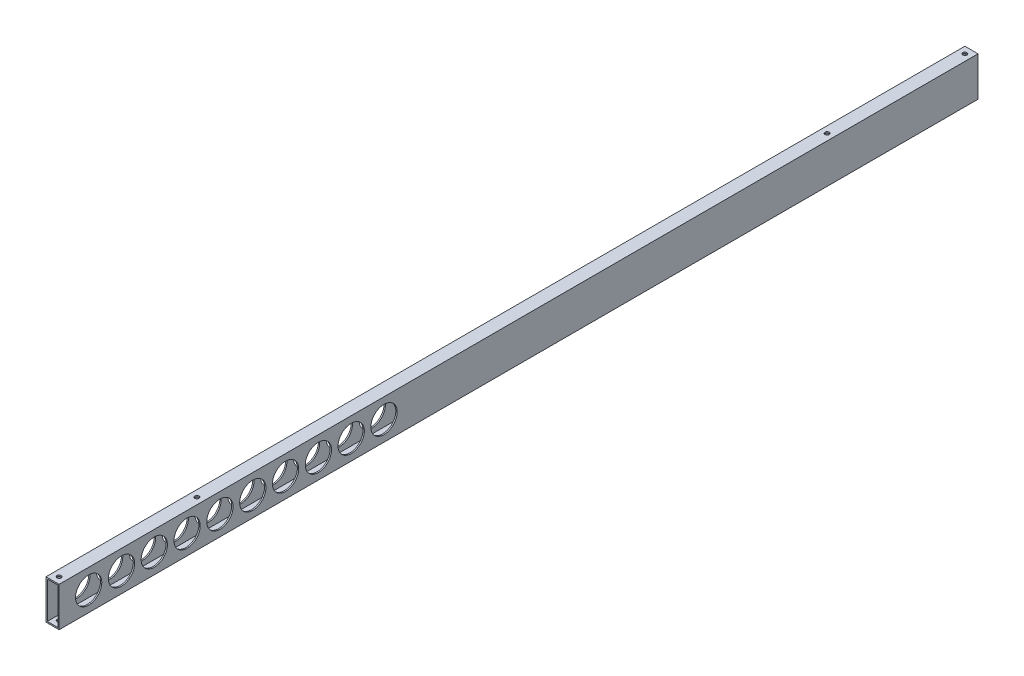
ISO-10303-21;
HEADER;
FILE_DESCRIPTION(('STEP AP214'),'2;1');
FILE_NAME('part.step','',(''),(''),'','','');
FILE_SCHEMA(('AUTOMOTIVE_DESIGN { 1 0 10303 214 1 1 1 1 }'));
ENDSEC;
DATA;
#1=APPLICATION_CONTEXT('core data for automotive mechanical design processes');
#2=APPLICATION_PROTOCOL_DEFINITION('international standard','automotive_design',2000,#1);
#3=PRODUCT_CONTEXT('',#1,'mechanical');
#4=PRODUCT('Part','Part','',(#3));
#5=PRODUCT_RELATED_PRODUCT_CATEGORY('part','',(#4));
#6=PRODUCT_DEFINITION_FORMATION('','',#4);
#7=PRODUCT_DEFINITION_CONTEXT('part definition',#1,'design');
#8=PRODUCT_DEFINITION('design','',#6,#7);
#9=PRODUCT_DEFINITION_SHAPE('','',#8);
#10=(LENGTH_UNIT() NAMED_UNIT(*) SI_UNIT(.MILLI.,.METRE.));
#11=(NAMED_UNIT(*) PLANE_ANGLE_UNIT() SI_UNIT($,.RADIAN.));
#12=(NAMED_UNIT(*) SI_UNIT($,.STERADIAN.) SOLID_ANGLE_UNIT());
#13=UNCERTAINTY_MEASURE_WITH_UNIT(LENGTH_MEASURE(1.E-05),#10,'distance_accuracy_value','');
#14=(GEOMETRIC_REPRESENTATION_CONTEXT(3) GLOBAL_UNCERTAINTY_ASSIGNED_CONTEXT((#13)) GLOBAL_UNIT_ASSIGNED_CONTEXT((#10,
#11,#12)) REPRESENTATION_CONTEXT('',''));
#15=CARTESIAN_POINT('',(0.,0.,0.));
#16=DIRECTION('',(0.,0.,1.));
#17=DIRECTION('',(1.,0.,0.));
#18=AXIS2_PLACEMENT_3D('',#15,#16,#17);
#19=CARTESIAN_POINT('',(0.,0.,700.));
#20=DIRECTION('',(0.,0.,1.));
#21=DIRECTION('',(1.,0.,0.));
#22=AXIS2_PLACEMENT_3D('',#19,#20,#21);
#23=PLANE('',#22);
#24=DIRECTION('',(0.,-1.,0.));
#25=VECTOR('',#24,1.);
#26=CARTESIAN_POINT('',(-5.,-15.,700.));
#27=LINE('',#26,#25);
#28=CARTESIAN_POINT('',(-5.,15.,700.));
#29=VERTEX_POINT('',#28);
#30=CARTESIAN_POINT('',(-5.,-15.,700.));
#31=VERTEX_POINT('',#30);
#32=EDGE_CURVE('E162',#29,#31,#27,.T.);
#33=ORIENTED_EDGE('',*,*,#32,.T.);
#34=DIRECTION('',(1.,0.,0.));
#35=VECTOR('',#34,1.);
#36=CARTESIAN_POINT('',(5.,-15.,700.));
#37=LINE('',#36,#35);
#38=CARTESIAN_POINT('',(5.,-15.,700.));
#39=VERTEX_POINT('',#38);
#40=EDGE_CURVE('E165',#31,#39,#37,.T.);
#41=ORIENTED_EDGE('',*,*,#40,.T.);
#42=DIRECTION('',(0.,1.,0.));
#43=VECTOR('',#42,1.);
#44=CARTESIAN_POINT('',(5.,-15.,700.));
#45=LINE('',#44,#43);
#46=CARTESIAN_POINT('',(5.,15.,700.));
#47=VERTEX_POINT('',#46);
#48=EDGE_CURVE('E168',#39,#47,#45,.T.);
#49=ORIENTED_EDGE('',*,*,#48,.T.);
#50=DIRECTION('',(-1.,0.,0.));
#51=VECTOR('',#50,1.);
#52=CARTESIAN_POINT('',(5.,15.,700.));
#53=LINE('',#52,#51);
#54=EDGE_CURVE('E170',#47,#29,#53,.T.);
#55=ORIENTED_EDGE('',*,*,#54,.T.);
#56=EDGE_LOOP('',(#33,#41,#49,#55));
#57=FACE_BOUND('',#56,.T.);
#58=DIRECTION('',(1.,0.,0.));
#59=VECTOR('',#58,1.);
#60=CARTESIAN_POINT('',(5.,-14.,700.));
#61=LINE('',#60,#59);
#62=CARTESIAN_POINT('',(-4.,-14.,700.));
#63=VERTEX_POINT('',#62);
#64=CARTESIAN_POINT('',(4.,-14.,700.));
#65=VERTEX_POINT('',#64);
#66=EDGE_CURVE('E132',#63,#65,#61,.T.);
#67=ORIENTED_EDGE('',*,*,#66,.F.);
#68=DIRECTION('',(0.,-1.,0.));
#69=VECTOR('',#68,1.);
#70=CARTESIAN_POINT('',(-4.,-15.,700.));
#71=LINE('',#70,#69);
#72=CARTESIAN_POINT('',(-4.,14.,700.));
#73=VERTEX_POINT('',#72);
#74=EDGE_CURVE('E124',#73,#63,#71,.T.);
#75=ORIENTED_EDGE('',*,*,#74,.F.);
#76=DIRECTION('',(-1.,0.,0.));
#77=VECTOR('',#76,1.);
#78=CARTESIAN_POINT('',(5.,14.,700.));
#79=LINE('',#78,#77);
#80=CARTESIAN_POINT('',(4.,14.,700.));
#81=VERTEX_POINT('',#80);
#82=EDGE_CURVE('E146',#81,#73,#79,.T.);
#83=ORIENTED_EDGE('',*,*,#82,.F.);
#84=DIRECTION('',(0.,1.,0.));
#85=VECTOR('',#84,1.);
#86=CARTESIAN_POINT('',(4.,-15.,700.));
#87=LINE('',#86,#85);
#88=EDGE_CURVE('E144',#65,#81,#87,.T.);
#89=ORIENTED_EDGE('',*,*,#88,.F.);
#90=EDGE_LOOP('',(#67,#75,#83,#89));
#91=FACE_BOUND('',#90,.T.);
#92=ADVANCED_FACE('F57',(#57,#91),#23,.T.);
#93=CARTESIAN_POINT('',(0.,0.,0.));
#94=DIRECTION('',(0.,0.,1.));
#95=DIRECTION('',(1.,0.,0.));
#96=AXIS2_PLACEMENT_3D('',#93,#94,#95);
#97=PLANE('',#96);
#98=DIRECTION('',(0.,-1.,0.));
#99=VECTOR('',#98,1.);
#100=CARTESIAN_POINT('',(-5.,-15.,0.));
#101=LINE('',#100,#99);
#102=CARTESIAN_POINT('',(-5.,15.,0.));
#103=VERTEX_POINT('',#102);
#104=CARTESIAN_POINT('',(-5.,-15.,0.));
#105=VERTEX_POINT('',#104);
#106=EDGE_CURVE('E140',#103,#105,#101,.T.);
#107=ORIENTED_EDGE('',*,*,#106,.F.);
#108=DIRECTION('',(-1.,0.,0.));
#109=VECTOR('',#108,1.);
#110=CARTESIAN_POINT('',(5.,15.,0.));
#111=LINE('',#110,#109);
#112=CARTESIAN_POINT('',(5.,15.,0.));
#113=VERTEX_POINT('',#112);
#114=EDGE_CURVE('E166',#113,#103,#111,.T.);
#115=ORIENTED_EDGE('',*,*,#114,.F.);
#116=DIRECTION('',(0.,1.,0.));
#117=VECTOR('',#116,1.);
#118=CARTESIAN_POINT('',(5.,-15.,0.));
#119=LINE('',#118,#117);
#120=CARTESIAN_POINT('',(5.,-15.,0.));
#121=VERTEX_POINT('',#120);
#122=EDGE_CURVE('E177',#121,#113,#119,.T.);
#123=ORIENTED_EDGE('',*,*,#122,.F.);
#124=DIRECTION('',(1.,0.,0.));
#125=VECTOR('',#124,1.);
#126=CARTESIAN_POINT('',(5.,-15.,0.));
#127=LINE('',#126,#125);
#128=EDGE_CURVE('E175',#105,#121,#127,.T.);
#129=ORIENTED_EDGE('',*,*,#128,.F.);
#130=EDGE_LOOP('',(#107,#115,#123,#129));
#131=FACE_BOUND('',#130,.T.);
#132=DIRECTION('',(0.,-1.,0.));
#133=VECTOR('',#132,1.);
#134=CARTESIAN_POINT('',(-4.,-15.,0.));
#135=LINE('',#134,#133);
#136=CARTESIAN_POINT('',(-4.,14.,0.));
#137=VERTEX_POINT('',#136);
#138=CARTESIAN_POINT('',(-4.,-14.,0.));
#139=VERTEX_POINT('',#138);
#140=EDGE_CURVE('E82',#137,#139,#135,.T.);
#141=ORIENTED_EDGE('',*,*,#140,.T.);
#142=DIRECTION('',(1.,0.,0.));
#143=VECTOR('',#142,1.);
#144=CARTESIAN_POINT('',(5.,-14.,0.));
#145=LINE('',#144,#143);
#146=CARTESIAN_POINT('',(4.,-14.,0.));
#147=VERTEX_POINT('',#146);
#148=EDGE_CURVE('E139',#139,#147,#145,.T.);
#149=ORIENTED_EDGE('',*,*,#148,.T.);
#150=DIRECTION('',(0.,1.,0.));
#151=VECTOR('',#150,1.);
#152=CARTESIAN_POINT('',(4.,-15.,0.));
#153=LINE('',#152,#151);
#154=CARTESIAN_POINT('',(4.,14.,0.));
#155=VERTEX_POINT('',#154);
#156=EDGE_CURVE('E154',#147,#155,#153,.T.);
#157=ORIENTED_EDGE('',*,*,#156,.T.);
#158=DIRECTION('',(-1.,0.,0.));
#159=VECTOR('',#158,1.);
#160=CARTESIAN_POINT('',(5.,14.,0.));
#161=LINE('',#160,#159);
#162=EDGE_CURVE('E133',#155,#137,#161,.T.);
#163=ORIENTED_EDGE('',*,*,#162,.T.);
#164=EDGE_LOOP('',(#141,#149,#157,#163));
#165=FACE_BOUND('',#164,.T.);
#166=ADVANCED_FACE('F319',(#131,#165),#97,.F.);
#167=CARTESIAN_POINT('',(-5.,-15.,700.));
#168=DIRECTION('',(1.,0.,0.));
#169=DIRECTION('',(0.,0.,-1.));
#170=AXIS2_PLACEMENT_3D('',#167,#168,#169);
#171=PLANE('',#170);
#172=CARTESIAN_POINT('',(-5.,0.,677.5));
#173=DIRECTION('',(1.,0.,0.));
#174=DIRECTION('',(0.,0.,-1.));
#175=AXIS2_PLACEMENT_3D('',#172,#173,#174);
#176=CIRCLE('',#175,9.99999999999998);
#177=CARTESIAN_POINT('',(-5.,0.,667.5));
#178=VERTEX_POINT('',#177);
#179=EDGE_CURVE('E207',#178,#178,#176,.T.);
#180=ORIENTED_EDGE('',*,*,#179,.T.);
#181=EDGE_LOOP('',(#180));
#182=FACE_BOUND('',#181,.T.);
#183=CARTESIAN_POINT('',(-5.,0.,652.5));
#184=DIRECTION('',(1.,0.,0.));
#185=DIRECTION('',(0.,0.,-1.));
#186=AXIS2_PLACEMENT_3D('',#183,#184,#185);
#187=CIRCLE('',#186,9.99999999999998);
#188=CARTESIAN_POINT('',(-5.,0.,642.5));
#189=VERTEX_POINT('',#188);
#190=EDGE_CURVE('E436',#189,#189,#187,.T.);
#191=ORIENTED_EDGE('',*,*,#190,.T.);
#192=EDGE_LOOP('',(#191));
#193=FACE_BOUND('',#192,.T.);
#194=CARTESIAN_POINT('',(-5.,0.,627.5));
#195=DIRECTION('',(1.,0.,0.));
#196=DIRECTION('',(0.,0.,-1.));
#197=AXIS2_PLACEMENT_3D('',#194,#195,#196);
#198=CIRCLE('',#197,9.99999999999998);
#199=CARTESIAN_POINT('',(-5.,0.,617.5));
#200=VERTEX_POINT('',#199);
#201=EDGE_CURVE('E440',#200,#200,#198,.T.);
#202=ORIENTED_EDGE('',*,*,#201,.T.);
#203=EDGE_LOOP('',(#202));
#204=FACE_BOUND('',#203,.T.);
#205=CARTESIAN_POINT('',(-5.,0.,602.5));
#206=DIRECTION('',(1.,0.,0.));
#207=DIRECTION('',(0.,0.,-1.));
#208=AXIS2_PLACEMENT_3D('',#205,#206,#207);
#209=CIRCLE('',#208,10.0000000000001);
#210=CARTESIAN_POINT('',(-5.,0.,592.5));
#211=VERTEX_POINT('',#210);
#212=EDGE_CURVE('E444',#211,#211,#209,.T.);
#213=ORIENTED_EDGE('',*,*,#212,.T.);
#214=EDGE_LOOP('',(#213));
#215=FACE_BOUND('',#214,.T.);
#216=CARTESIAN_POINT('',(-5.,0.,577.5));
#217=DIRECTION('',(1.,0.,0.));
#218=DIRECTION('',(0.,0.,-1.));
#219=AXIS2_PLACEMENT_3D('',#216,#217,#218);
#220=CIRCLE('',#219,9.99999999999998);
#221=CARTESIAN_POINT('',(-5.,0.,567.5));
#222=VERTEX_POINT('',#221);
#223=EDGE_CURVE('E448',#222,#222,#220,.T.);
#224=ORIENTED_EDGE('',*,*,#223,.T.);
#225=EDGE_LOOP('',(#224));
#226=FACE_BOUND('',#225,.T.);
#227=CARTESIAN_POINT('',(-5.,0.,552.5));
#228=DIRECTION('',(1.,0.,0.));
#229=DIRECTION('',(0.,0.,-1.));
#230=AXIS2_PLACEMENT_3D('',#227,#228,#229);
#231=CIRCLE('',#230,9.99999999999998);
#232=CARTESIAN_POINT('',(-5.,0.,542.5));
#233=VERTEX_POINT('',#232);
#234=EDGE_CURVE('E452',#233,#233,#231,.T.);
#235=ORIENTED_EDGE('',*,*,#234,.T.);
#236=EDGE_LOOP('',(#235));
#237=FACE_BOUND('',#236,.T.);
#238=CARTESIAN_POINT('',(-5.,0.,527.5));
#239=DIRECTION('',(1.,0.,0.));
#240=DIRECTION('',(0.,0.,-1.));
#241=AXIS2_PLACEMENT_3D('',#238,#239,#240);
#242=CIRCLE('',#241,9.99999999999998);
#243=CARTESIAN_POINT('',(-5.,0.,517.5));
#244=VERTEX_POINT('',#243);
#245=EDGE_CURVE('E456',#244,#244,#242,.T.);
#246=ORIENTED_EDGE('',*,*,#245,.T.);
#247=EDGE_LOOP('',(#246));
#248=FACE_BOUND('',#247,.T.);
#249=CARTESIAN_POINT('',(-5.,0.,502.5));
#250=DIRECTION('',(1.,0.,0.));
#251=DIRECTION('',(0.,0.,-1.));
#252=AXIS2_PLACEMENT_3D('',#249,#250,#251);
#253=CIRCLE('',#252,9.99999999999998);
#254=CARTESIAN_POINT('',(-5.,0.,492.5));
#255=VERTEX_POINT('',#254);
#256=EDGE_CURVE('E460',#255,#255,#253,.T.);
#257=ORIENTED_EDGE('',*,*,#256,.T.);
#258=EDGE_LOOP('',(#257));
#259=FACE_BOUND('',#258,.T.);
#260=CARTESIAN_POINT('',(-5.,0.,477.5));
#261=DIRECTION('',(1.,0.,0.));
#262=DIRECTION('',(0.,0.,-1.));
#263=AXIS2_PLACEMENT_3D('',#260,#261,#262);
#264=CIRCLE('',#263,9.99999999999998);
#265=CARTESIAN_POINT('',(-5.,0.,467.5));
#266=VERTEX_POINT('',#265);
#267=EDGE_CURVE('E463',#266,#266,#264,.T.);
#268=ORIENTED_EDGE('',*,*,#267,.T.);
#269=EDGE_LOOP('',(#268));
#270=FACE_BOUND('',#269,.T.);
#271=CARTESIAN_POINT('',(-5.,0.,452.5));
#272=DIRECTION('',(1.,0.,0.));
#273=DIRECTION('',(0.,0.,-1.));
#274=AXIS2_PLACEMENT_3D('',#271,#272,#273);
#275=CIRCLE('',#274,9.99999999999998);
#276=CARTESIAN_POINT('',(-5.,0.,442.5));
#277=VERTEX_POINT('',#276);
#278=EDGE_CURVE('E383',#277,#277,#275,.T.);
#279=ORIENTED_EDGE('',*,*,#278,.T.);
#280=EDGE_LOOP('',(#279));
#281=FACE_BOUND('',#280,.T.);
#282=ORIENTED_EDGE('',*,*,#106,.T.);
#283=DIRECTION('',(0.,0.,-1.));
#284=VECTOR('',#283,1.);
#285=CARTESIAN_POINT('',(-5.,-15.,700.));
#286=LINE('',#285,#284);
#287=EDGE_CURVE('E12',#31,#105,#286,.T.);
#288=ORIENTED_EDGE('',*,*,#287,.F.);
#289=ORIENTED_EDGE('',*,*,#32,.F.);
#290=DIRECTION('',(0.,0.,-1.));
#291=VECTOR('',#290,1.);
#292=CARTESIAN_POINT('',(-5.,15.,700.));
#293=LINE('',#292,#291);
#294=EDGE_CURVE('E172',#29,#103,#293,.T.);
#295=ORIENTED_EDGE('',*,*,#294,.T.);
#296=EDGE_LOOP('',(#282,#288,#289,#295));
#297=FACE_BOUND('',#296,.T.);
#298=ADVANCED_FACE('F59',(#182,#193,#204,#215,#226,#237,#248,#259,#270,#281,#297),#171,.F.);
#299=CARTESIAN_POINT('',(5.,-15.,700.));
#300=DIRECTION('',(0.,1.,0.));
#301=DIRECTION('',(-1.,0.,0.));
#302=AXIS2_PLACEMENT_3D('',#299,#300,#301);
#303=PLANE('',#302);
#304=CARTESIAN_POINT('',(0.,-15.,5.));
#305=DIRECTION('',(0.,1.,0.));
#306=DIRECTION('',(0.,0.,1.));
#307=AXIS2_PLACEMENT_3D('',#304,#305,#306);
#308=CIRCLE('',#307,1.6);
#309=CARTESIAN_POINT('',(0.,-15.,6.6));
#310=VERTEX_POINT('',#309);
#311=EDGE_CURVE('E191',#310,#310,#308,.T.);
#312=ORIENTED_EDGE('',*,*,#311,.T.);
#313=EDGE_LOOP('',(#312));
#314=FACE_BOUND('',#313,.T.);
#315=CARTESIAN_POINT('',(0.,-15.,590.));
#316=DIRECTION('',(0.,1.,0.));
#317=DIRECTION('',(0.,0.,-1.));
#318=AXIS2_PLACEMENT_3D('',#315,#316,#317);
#319=CIRCLE('',#318,1.59999999999999);
#320=CARTESIAN_POINT('',(0.,-15.,588.4));
#321=VERTEX_POINT('',#320);
#322=EDGE_CURVE('E259',#321,#321,#319,.T.);
#323=ORIENTED_EDGE('',*,*,#322,.T.);
#324=EDGE_LOOP('',(#323));
#325=FACE_BOUND('',#324,.T.);
#326=CARTESIAN_POINT('',(0.,-15.,695.));
#327=DIRECTION('',(0.,1.,0.));
#328=DIRECTION('',(0.,0.,-1.));
#329=AXIS2_PLACEMENT_3D('',#326,#327,#328);
#330=CIRCLE('',#329,1.59999999999999);
#331=CARTESIAN_POINT('',(0.,-15.,693.4));
#332=VERTEX_POINT('',#331);
#333=EDGE_CURVE('E270',#332,#332,#330,.T.);
#334=ORIENTED_EDGE('',*,*,#333,.T.);
#335=EDGE_LOOP('',(#334));
#336=FACE_BOUND('',#335,.T.);
#337=CARTESIAN_POINT('',(0.,-15.,110.));
#338=DIRECTION('',(0.,1.,0.));
#339=DIRECTION('',(0.,0.,1.));
#340=AXIS2_PLACEMENT_3D('',#337,#338,#339);
#341=CIRCLE('',#340,1.6);
#342=CARTESIAN_POINT('',(0.,-15.,111.6));
#343=VERTEX_POINT('',#342);
#344=EDGE_CURVE('E258',#343,#343,#341,.T.);
#345=ORIENTED_EDGE('',*,*,#344,.T.);
#346=EDGE_LOOP('',(#345));
#347=FACE_BOUND('',#346,.T.);
#348=ORIENTED_EDGE('',*,*,#128,.T.);
#349=DIRECTION('',(0.,0.,-1.));
#350=VECTOR('',#349,1.);
#351=CARTESIAN_POINT('',(5.,-15.,700.));
#352=LINE('',#351,#350);
#353=EDGE_CURVE('E66',#39,#121,#352,.T.);
#354=ORIENTED_EDGE('',*,*,#353,.F.);
#355=ORIENTED_EDGE('',*,*,#40,.F.);
#356=ORIENTED_EDGE('',*,*,#287,.T.);
#357=EDGE_LOOP('',(#348,#354,#355,#356));
#358=FACE_BOUND('',#357,.T.);
#359=ADVANCED_FACE('F305',(#314,#325,#336,#347,#358),#303,.F.);
#360=CARTESIAN_POINT('',(5.,-15.,700.));
#361=DIRECTION('',(-1.,0.,0.));
#362=DIRECTION('',(0.,0.,1.));
#363=AXIS2_PLACEMENT_3D('',#360,#361,#362);
#364=PLANE('',#363);
#365=CARTESIAN_POINT('',(5.,0.,677.5));
#366=DIRECTION('',(1.,0.,0.));
#367=DIRECTION('',(0.,0.,-1.));
#368=AXIS2_PLACEMENT_3D('',#365,#366,#367);
#369=CIRCLE('',#368,9.99999999999998);
#370=CARTESIAN_POINT('',(5.,0.,667.5));
#371=VERTEX_POINT('',#370);
#372=EDGE_CURVE('E346',#371,#371,#369,.T.);
#373=ORIENTED_EDGE('',*,*,#372,.F.);
#374=EDGE_LOOP('',(#373));
#375=FACE_BOUND('',#374,.T.);
#376=CARTESIAN_POINT('',(5.,0.,652.5));
#377=DIRECTION('',(1.,0.,0.));
#378=DIRECTION('',(0.,0.,-1.));
#379=AXIS2_PLACEMENT_3D('',#376,#377,#378);
#380=CIRCLE('',#379,9.99999999999998);
#381=CARTESIAN_POINT('',(5.,0.,642.5));
#382=VERTEX_POINT('',#381);
#383=EDGE_CURVE('E350',#382,#382,#380,.T.);
#384=ORIENTED_EDGE('',*,*,#383,.F.);
#385=EDGE_LOOP('',(#384));
#386=FACE_BOUND('',#385,.T.);
#387=CARTESIAN_POINT('',(5.,0.,627.5));
#388=DIRECTION('',(1.,0.,0.));
#389=DIRECTION('',(0.,0.,-1.));
#390=AXIS2_PLACEMENT_3D('',#387,#388,#389);
#391=CIRCLE('',#390,9.99999999999998);
#392=CARTESIAN_POINT('',(5.,0.,617.5));
#393=VERTEX_POINT('',#392);
#394=EDGE_CURVE('E354',#393,#393,#391,.T.);
#395=ORIENTED_EDGE('',*,*,#394,.F.);
#396=EDGE_LOOP('',(#395));
#397=FACE_BOUND('',#396,.T.);
#398=CARTESIAN_POINT('',(5.,0.,602.5));
#399=DIRECTION('',(1.,0.,0.));
#400=DIRECTION('',(0.,0.,-1.));
#401=AXIS2_PLACEMENT_3D('',#398,#399,#400);
#402=CIRCLE('',#401,10.0000000000001);
#403=CARTESIAN_POINT('',(5.,0.,592.5));
#404=VERTEX_POINT('',#403);
#405=EDGE_CURVE('E358',#404,#404,#402,.T.);
#406=ORIENTED_EDGE('',*,*,#405,.F.);
#407=EDGE_LOOP('',(#406));
#408=FACE_BOUND('',#407,.T.);
#409=CARTESIAN_POINT('',(5.,0.,577.5));
#410=DIRECTION('',(1.,0.,0.));
#411=DIRECTION('',(0.,0.,-1.));
#412=AXIS2_PLACEMENT_3D('',#409,#410,#411);
#413=CIRCLE('',#412,9.99999999999998);
#414=CARTESIAN_POINT('',(5.,0.,567.5));
#415=VERTEX_POINT('',#414);
#416=EDGE_CURVE('E362',#415,#415,#413,.T.);
#417=ORIENTED_EDGE('',*,*,#416,.F.);
#418=EDGE_LOOP('',(#417));
#419=FACE_BOUND('',#418,.T.);
#420=CARTESIAN_POINT('',(5.,0.,552.5));
#421=DIRECTION('',(1.,0.,0.));
#422=DIRECTION('',(0.,0.,-1.));
#423=AXIS2_PLACEMENT_3D('',#420,#421,#422);
#424=CIRCLE('',#423,9.99999999999998);
#425=CARTESIAN_POINT('',(5.,0.,542.5));
#426=VERTEX_POINT('',#425);
#427=EDGE_CURVE('E366',#426,#426,#424,.T.);
#428=ORIENTED_EDGE('',*,*,#427,.F.);
#429=EDGE_LOOP('',(#428));
#430=FACE_BOUND('',#429,.T.);
#431=CARTESIAN_POINT('',(5.,0.,527.5));
#432=DIRECTION('',(1.,0.,0.));
#433=DIRECTION('',(0.,0.,-1.));
#434=AXIS2_PLACEMENT_3D('',#431,#432,#433);
#435=CIRCLE('',#434,9.99999999999998);
#436=CARTESIAN_POINT('',(5.,0.,517.5));
#437=VERTEX_POINT('',#436);
#438=EDGE_CURVE('E370',#437,#437,#435,.T.);
#439=ORIENTED_EDGE('',*,*,#438,.F.);
#440=EDGE_LOOP('',(#439));
#441=FACE_BOUND('',#440,.T.);
#442=CARTESIAN_POINT('',(5.,0.,502.5));
#443=DIRECTION('',(1.,0.,0.));
#444=DIRECTION('',(0.,0.,-1.));
#445=AXIS2_PLACEMENT_3D('',#442,#443,#444);
#446=CIRCLE('',#445,9.99999999999998);
#447=CARTESIAN_POINT('',(5.,0.,492.5));
#448=VERTEX_POINT('',#447);
#449=EDGE_CURVE('E374',#448,#448,#446,.T.);
#450=ORIENTED_EDGE('',*,*,#449,.F.);
#451=EDGE_LOOP('',(#450));
#452=FACE_BOUND('',#451,.T.);
#453=CARTESIAN_POINT('',(5.,0.,477.5));
#454=DIRECTION('',(1.,0.,0.));
#455=DIRECTION('',(0.,0.,-1.));
#456=AXIS2_PLACEMENT_3D('',#453,#454,#455);
#457=CIRCLE('',#456,9.99999999999998);
#458=CARTESIAN_POINT('',(5.,0.,467.5));
#459=VERTEX_POINT('',#458);
#460=EDGE_CURVE('E378',#459,#459,#457,.T.);
#461=ORIENTED_EDGE('',*,*,#460,.F.);
#462=EDGE_LOOP('',(#461));
#463=FACE_BOUND('',#462,.T.);
#464=CARTESIAN_POINT('',(5.,0.,452.5));
#465=DIRECTION('',(1.,0.,0.));
#466=DIRECTION('',(0.,0.,-1.));
#467=AXIS2_PLACEMENT_3D('',#464,#465,#466);
#468=CIRCLE('',#467,9.99999999999998);
#469=CARTESIAN_POINT('',(5.,0.,442.5));
#470=VERTEX_POINT('',#469);
#471=EDGE_CURVE('E381',#470,#470,#468,.T.);
#472=ORIENTED_EDGE('',*,*,#471,.F.);
#473=EDGE_LOOP('',(#472));
#474=FACE_BOUND('',#473,.T.);
#475=ORIENTED_EDGE('',*,*,#122,.T.);
#476=DIRECTION('',(0.,0.,-1.));
#477=VECTOR('',#476,1.);
#478=CARTESIAN_POINT('',(5.,15.,700.));
#479=LINE('',#478,#477);
#480=EDGE_CURVE('E182',#47,#113,#479,.T.);
#481=ORIENTED_EDGE('',*,*,#480,.F.);
#482=ORIENTED_EDGE('',*,*,#48,.F.);
#483=ORIENTED_EDGE('',*,*,#353,.T.);
#484=EDGE_LOOP('',(#475,#481,#482,#483));
#485=FACE_BOUND('',#484,.T.);
#486=ADVANCED_FACE('F308',(#375,#386,#397,#408,#419,#430,#441,#452,#463,#474,#485),#364,.F.);
#487=CARTESIAN_POINT('',(5.,15.,700.));
#488=DIRECTION('',(0.,-1.,0.));
#489=DIRECTION('',(0.,0.,-1.));
#490=AXIS2_PLACEMENT_3D('',#487,#488,#489);
#491=PLANE('',#490);
#492=CARTESIAN_POINT('',(0.,15.,5.));
#493=DIRECTION('',(0.,1.,0.));
#494=DIRECTION('',(0.,0.,1.));
#495=AXIS2_PLACEMENT_3D('',#492,#493,#494);
#496=CIRCLE('',#495,1.6);
#497=CARTESIAN_POINT('',(0.,15.,6.6));
#498=VERTEX_POINT('',#497);
#499=EDGE_CURVE('E255',#498,#498,#496,.T.);
#500=ORIENTED_EDGE('',*,*,#499,.F.);
#501=EDGE_LOOP('',(#500));
#502=FACE_BOUND('',#501,.T.);
#503=CARTESIAN_POINT('',(0.,15.,590.));
#504=DIRECTION('',(0.,1.,0.));
#505=DIRECTION('',(0.,0.,-1.));
#506=AXIS2_PLACEMENT_3D('',#503,#504,#505);
#507=CIRCLE('',#506,1.59999999999999);
#508=CARTESIAN_POINT('',(0.,15.,588.4));
#509=VERTEX_POINT('',#508);
#510=EDGE_CURVE('E252',#509,#509,#507,.T.);
#511=ORIENTED_EDGE('',*,*,#510,.F.);
#512=EDGE_LOOP('',(#511));
#513=FACE_BOUND('',#512,.T.);
#514=CARTESIAN_POINT('',(0.,15.,695.));
#515=DIRECTION('',(0.,1.,0.));
#516=DIRECTION('',(0.,0.,-1.));
#517=AXIS2_PLACEMENT_3D('',#514,#515,#516);
#518=CIRCLE('',#517,1.59999999999999);
#519=CARTESIAN_POINT('',(0.,15.,693.4));
#520=VERTEX_POINT('',#519);
#521=EDGE_CURVE('E262',#520,#520,#518,.T.);
#522=ORIENTED_EDGE('',*,*,#521,.F.);
#523=EDGE_LOOP('',(#522));
#524=FACE_BOUND('',#523,.T.);
#525=CARTESIAN_POINT('',(0.,15.,110.));
#526=DIRECTION('',(0.,1.,0.));
#527=DIRECTION('',(0.,0.,1.));
#528=AXIS2_PLACEMENT_3D('',#525,#526,#527);
#529=CIRCLE('',#528,1.6);
#530=CARTESIAN_POINT('',(0.,15.,111.6));
#531=VERTEX_POINT('',#530);
#532=EDGE_CURVE('E267',#531,#531,#529,.T.);
#533=ORIENTED_EDGE('',*,*,#532,.F.);
#534=EDGE_LOOP('',(#533));
#535=FACE_BOUND('',#534,.T.);
#536=ORIENTED_EDGE('',*,*,#114,.T.);
#537=ORIENTED_EDGE('',*,*,#294,.F.);
#538=ORIENTED_EDGE('',*,*,#54,.F.);
#539=ORIENTED_EDGE('',*,*,#480,.T.);
#540=EDGE_LOOP('',(#536,#537,#538,#539));
#541=FACE_BOUND('',#540,.T.);
#542=ADVANCED_FACE('F323',(#502,#513,#524,#535,#541),#491,.F.);
#543=CARTESIAN_POINT('',(-4.,-15.,700.));
#544=DIRECTION('',(1.,0.,0.));
#545=DIRECTION('',(0.,0.,-1.));
#546=AXIS2_PLACEMENT_3D('',#543,#544,#545);
#547=PLANE('',#546);
#548=CARTESIAN_POINT('',(-4.,0.,677.5));
#549=DIRECTION('',(1.,0.,0.));
#550=DIRECTION('',(0.,0.,-1.));
#551=AXIS2_PLACEMENT_3D('',#548,#549,#550);
#552=CIRCLE('',#551,9.99999999999998);
#553=CARTESIAN_POINT('',(-4.,0.,667.5));
#554=VERTEX_POINT('',#553);
#555=EDGE_CURVE('E249',#554,#554,#552,.T.);
#556=ORIENTED_EDGE('',*,*,#555,.F.);
#557=EDGE_LOOP('',(#556));
#558=FACE_BOUND('',#557,.T.);
#559=CARTESIAN_POINT('',(-4.,0.,652.5));
#560=DIRECTION('',(1.,0.,0.));
#561=DIRECTION('',(0.,0.,-1.));
#562=AXIS2_PLACEMENT_3D('',#559,#560,#561);
#563=CIRCLE('',#562,9.99999999999998);
#564=CARTESIAN_POINT('',(-4.,0.,642.5));
#565=VERTEX_POINT('',#564);
#566=EDGE_CURVE('E237',#565,#565,#563,.T.);
#567=ORIENTED_EDGE('',*,*,#566,.F.);
#568=EDGE_LOOP('',(#567));
#569=FACE_BOUND('',#568,.T.);
#570=CARTESIAN_POINT('',(-4.,0.,627.5));
#571=DIRECTION('',(1.,0.,0.));
#572=DIRECTION('',(0.,0.,-1.));
#573=AXIS2_PLACEMENT_3D('',#570,#571,#572);
#574=CIRCLE('',#573,9.99999999999998);
#575=CARTESIAN_POINT('',(-4.,0.,617.5));
#576=VERTEX_POINT('',#575);
#577=EDGE_CURVE('E234',#576,#576,#574,.T.);
#578=ORIENTED_EDGE('',*,*,#577,.F.);
#579=EDGE_LOOP('',(#578));
#580=FACE_BOUND('',#579,.T.);
#581=CARTESIAN_POINT('',(-4.,0.,602.5));
#582=DIRECTION('',(1.,0.,0.));
#583=DIRECTION('',(0.,0.,-1.));
#584=AXIS2_PLACEMENT_3D('',#581,#582,#583);
#585=CIRCLE('',#584,10.0000000000001);
#586=CARTESIAN_POINT('',(-4.,0.,592.5));
#587=VERTEX_POINT('',#586);
#588=EDGE_CURVE('E231',#587,#587,#585,.T.);
#589=ORIENTED_EDGE('',*,*,#588,.F.);
#590=EDGE_LOOP('',(#589));
#591=FACE_BOUND('',#590,.T.);
#592=CARTESIAN_POINT('',(-4.,0.,577.5));
#593=DIRECTION('',(1.,0.,0.));
#594=DIRECTION('',(0.,0.,-1.));
#595=AXIS2_PLACEMENT_3D('',#592,#593,#594);
#596=CIRCLE('',#595,9.99999999999998);
#597=CARTESIAN_POINT('',(-4.,0.,567.5));
#598=VERTEX_POINT('',#597);
#599=EDGE_CURVE('E227',#598,#598,#596,.T.);
#600=ORIENTED_EDGE('',*,*,#599,.F.);
#601=EDGE_LOOP('',(#600));
#602=FACE_BOUND('',#601,.T.);
#603=CARTESIAN_POINT('',(-4.,0.,552.5));
#604=DIRECTION('',(1.,0.,0.));
#605=DIRECTION('',(0.,0.,-1.));
#606=AXIS2_PLACEMENT_3D('',#603,#604,#605);
#607=CIRCLE('',#606,9.99999999999998);
#608=CARTESIAN_POINT('',(-4.,0.,542.5));
#609=VERTEX_POINT('',#608);
#610=EDGE_CURVE('E223',#609,#609,#607,.T.);
#611=ORIENTED_EDGE('',*,*,#610,.F.);
#612=EDGE_LOOP('',(#611));
#613=FACE_BOUND('',#612,.T.);
#614=CARTESIAN_POINT('',(-4.,0.,527.5));
#615=DIRECTION('',(1.,0.,0.));
#616=DIRECTION('',(0.,0.,-1.));
#617=AXIS2_PLACEMENT_3D('',#614,#615,#616);
#618=CIRCLE('',#617,9.99999999999998);
#619=CARTESIAN_POINT('',(-4.,0.,517.5));
#620=VERTEX_POINT('',#619);
#621=EDGE_CURVE('E219',#620,#620,#618,.T.);
#622=ORIENTED_EDGE('',*,*,#621,.F.);
#623=EDGE_LOOP('',(#622));
#624=FACE_BOUND('',#623,.T.);
#625=CARTESIAN_POINT('',(-4.,0.,502.5));
#626=DIRECTION('',(1.,0.,0.));
#627=DIRECTION('',(0.,0.,-1.));
#628=AXIS2_PLACEMENT_3D('',#625,#626,#627);
#629=CIRCLE('',#628,9.99999999999998);
#630=CARTESIAN_POINT('',(-4.,0.,492.5));
#631=VERTEX_POINT('',#630);
#632=EDGE_CURVE('E215',#631,#631,#629,.T.);
#633=ORIENTED_EDGE('',*,*,#632,.F.);
#634=EDGE_LOOP('',(#633));
#635=FACE_BOUND('',#634,.T.);
#636=CARTESIAN_POINT('',(-4.,0.,477.5));
#637=DIRECTION('',(1.,0.,0.));
#638=DIRECTION('',(0.,0.,-1.));
#639=AXIS2_PLACEMENT_3D('',#636,#637,#638);
#640=CIRCLE('',#639,9.99999999999998);
#641=CARTESIAN_POINT('',(-4.,0.,467.5));
#642=VERTEX_POINT('',#641);
#643=EDGE_CURVE('E211',#642,#642,#640,.T.);
#644=ORIENTED_EDGE('',*,*,#643,.F.);
#645=EDGE_LOOP('',(#644));
#646=FACE_BOUND('',#645,.T.);
#647=CARTESIAN_POINT('',(-4.,0.,452.5));
#648=DIRECTION('',(1.,0.,0.));
#649=DIRECTION('',(0.,0.,-1.));
#650=AXIS2_PLACEMENT_3D('',#647,#648,#649);
#651=CIRCLE('',#650,9.99999999999998);
#652=CARTESIAN_POINT('',(-4.,0.,442.5));
#653=VERTEX_POINT('',#652);
#654=EDGE_CURVE('E206',#653,#653,#651,.T.);
#655=ORIENTED_EDGE('',*,*,#654,.F.);
#656=EDGE_LOOP('',(#655));
#657=FACE_BOUND('',#656,.T.);
#658=ORIENTED_EDGE('',*,*,#140,.F.);
#659=DIRECTION('',(0.,0.,-1.));
#660=VECTOR('',#659,1.);
#661=CARTESIAN_POINT('',(-4.,14.,700.));
#662=LINE('',#661,#660);
#663=EDGE_CURVE('E128',#73,#137,#662,.T.);
#664=ORIENTED_EDGE('',*,*,#663,.F.);
#665=ORIENTED_EDGE('',*,*,#74,.T.);
#666=DIRECTION('',(0.,0.,-1.));
#667=VECTOR('',#666,1.);
#668=CARTESIAN_POINT('',(-4.,-14.,700.));
#669=LINE('',#668,#667);
#670=EDGE_CURVE('E127',#63,#139,#669,.T.);
#671=ORIENTED_EDGE('',*,*,#670,.T.);
#672=EDGE_LOOP('',(#658,#664,#665,#671));
#673=FACE_BOUND('',#672,.T.);
#674=ADVANCED_FACE('F126',(#558,#569,#580,#591,#602,#613,#624,#635,#646,#657,#673),#547,.T.);
#675=CARTESIAN_POINT('',(5.,-14.,700.));
#676=DIRECTION('',(0.,1.,0.));
#677=DIRECTION('',(-1.,0.,0.));
#678=AXIS2_PLACEMENT_3D('',#675,#676,#677);
#679=PLANE('',#678);
#680=CARTESIAN_POINT('',(0.,-14.,5.));
#681=DIRECTION('',(0.,1.,0.));
#682=DIRECTION('',(-1.,0.,0.));
#683=AXIS2_PLACEMENT_3D('',#680,#681,#682);
#684=CIRCLE('',#683,1.6);
#685=CARTESIAN_POINT('',(-1.6,-14.,5.));
#686=VERTEX_POINT('',#685);
#687=EDGE_CURVE('E152',#686,#686,#684,.T.);
#688=ORIENTED_EDGE('',*,*,#687,.F.);
#689=EDGE_LOOP('',(#688));
#690=FACE_BOUND('',#689,.T.);
#691=CARTESIAN_POINT('',(0.,-14.,590.));
#692=DIRECTION('',(0.,1.,0.));
#693=DIRECTION('',(-1.,0.,0.));
#694=AXIS2_PLACEMENT_3D('',#691,#692,#693);
#695=CIRCLE('',#694,1.59999999999999);
#696=CARTESIAN_POINT('',(-1.59999999999999,-14.,590.));
#697=VERTEX_POINT('',#696);
#698=EDGE_CURVE('E199',#697,#697,#695,.T.);
#699=ORIENTED_EDGE('',*,*,#698,.F.);
#700=EDGE_LOOP('',(#699));
#701=FACE_BOUND('',#700,.T.);
#702=CARTESIAN_POINT('',(0.,-14.,695.));
#703=DIRECTION('',(0.,1.,0.));
#704=DIRECTION('',(-1.,0.,0.));
#705=AXIS2_PLACEMENT_3D('',#702,#703,#704);
#706=CIRCLE('',#705,1.59999999999999);
#707=CARTESIAN_POINT('',(-1.59999999999999,-14.,695.));
#708=VERTEX_POINT('',#707);
#709=EDGE_CURVE('E195',#708,#708,#706,.T.);
#710=ORIENTED_EDGE('',*,*,#709,.F.);
#711=EDGE_LOOP('',(#710));
#712=FACE_BOUND('',#711,.T.);
#713=CARTESIAN_POINT('',(0.,-14.,110.));
#714=DIRECTION('',(0.,1.,0.));
#715=DIRECTION('',(-1.,0.,0.));
#716=AXIS2_PLACEMENT_3D('',#713,#714,#715);
#717=CIRCLE('',#716,1.6);
#718=CARTESIAN_POINT('',(-1.6,-14.,110.));
#719=VERTEX_POINT('',#718);
#720=EDGE_CURVE('E190',#719,#719,#717,.T.);
#721=ORIENTED_EDGE('',*,*,#720,.F.);
#722=EDGE_LOOP('',(#721));
#723=FACE_BOUND('',#722,.T.);
#724=ORIENTED_EDGE('',*,*,#148,.F.);
#725=ORIENTED_EDGE('',*,*,#670,.F.);
#726=ORIENTED_EDGE('',*,*,#66,.T.);
#727=DIRECTION('',(0.,0.,-1.));
#728=VECTOR('',#727,1.);
#729=CARTESIAN_POINT('',(4.,-14.,700.));
#730=LINE('',#729,#728);
#731=EDGE_CURVE('E141',#65,#147,#730,.T.);
#732=ORIENTED_EDGE('',*,*,#731,.T.);
#733=EDGE_LOOP('',(#724,#725,#726,#732));
#734=FACE_BOUND('',#733,.T.);
#735=ADVANCED_FACE('F136',(#690,#701,#712,#723,#734),#679,.T.);
#736=CARTESIAN_POINT('',(4.,-15.,700.));
#737=DIRECTION('',(-1.,0.,0.));
#738=DIRECTION('',(0.,0.,1.));
#739=AXIS2_PLACEMENT_3D('',#736,#737,#738);
#740=PLANE('',#739);
#741=CARTESIAN_POINT('',(4.,0.,677.5));
#742=DIRECTION('',(-1.,0.,0.));
#743=DIRECTION('',(0.,0.,1.));
#744=AXIS2_PLACEMENT_3D('',#741,#742,#743);
#745=CIRCLE('',#744,9.99999999999998);
#746=CARTESIAN_POINT('',(4.,0.,687.5));
#747=VERTEX_POINT('',#746);
#748=EDGE_CURVE('E61',#747,#747,#745,.T.);
#749=ORIENTED_EDGE('',*,*,#748,.F.);
#750=EDGE_LOOP('',(#749));
#751=FACE_BOUND('',#750,.T.);
#752=CARTESIAN_POINT('',(4.,0.,652.5));
#753=DIRECTION('',(-1.,0.,0.));
#754=DIRECTION('',(0.,0.,1.));
#755=AXIS2_PLACEMENT_3D('',#752,#753,#754);
#756=CIRCLE('',#755,9.99999999999998);
#757=CARTESIAN_POINT('',(4.,0.,662.5));
#758=VERTEX_POINT('',#757);
#759=EDGE_CURVE('E235',#758,#758,#756,.T.);
#760=ORIENTED_EDGE('',*,*,#759,.F.);
#761=EDGE_LOOP('',(#760));
#762=FACE_BOUND('',#761,.T.);
#763=CARTESIAN_POINT('',(4.,0.,627.5));
#764=DIRECTION('',(-1.,0.,0.));
#765=DIRECTION('',(0.,0.,1.));
#766=AXIS2_PLACEMENT_3D('',#763,#764,#765);
#767=CIRCLE('',#766,9.99999999999998);
#768=CARTESIAN_POINT('',(4.,0.,637.5));
#769=VERTEX_POINT('',#768);
#770=EDGE_CURVE('E232',#769,#769,#767,.T.);
#771=ORIENTED_EDGE('',*,*,#770,.F.);
#772=EDGE_LOOP('',(#771));
#773=FACE_BOUND('',#772,.T.);
#774=CARTESIAN_POINT('',(4.,0.,602.5));
#775=DIRECTION('',(-1.,0.,0.));
#776=DIRECTION('',(0.,0.,1.));
#777=AXIS2_PLACEMENT_3D('',#774,#775,#776);
#778=CIRCLE('',#777,10.0000000000001);
#779=CARTESIAN_POINT('',(4.,0.,612.5));
#780=VERTEX_POINT('',#779);
#781=EDGE_CURVE('E228',#780,#780,#778,.T.);
#782=ORIENTED_EDGE('',*,*,#781,.F.);
#783=EDGE_LOOP('',(#782));
#784=FACE_BOUND('',#783,.T.);
#785=CARTESIAN_POINT('',(4.,0.,577.5));
#786=DIRECTION('',(-1.,0.,0.));
#787=DIRECTION('',(0.,0.,1.));
#788=AXIS2_PLACEMENT_3D('',#785,#786,#787);
#789=CIRCLE('',#788,9.99999999999998);
#790=CARTESIAN_POINT('',(4.,0.,587.5));
#791=VERTEX_POINT('',#790);
#792=EDGE_CURVE('E224',#791,#791,#789,.T.);
#793=ORIENTED_EDGE('',*,*,#792,.F.);
#794=EDGE_LOOP('',(#793));
#795=FACE_BOUND('',#794,.T.);
#796=CARTESIAN_POINT('',(4.,0.,552.5));
#797=DIRECTION('',(-1.,0.,0.));
#798=DIRECTION('',(0.,0.,1.));
#799=AXIS2_PLACEMENT_3D('',#796,#797,#798);
#800=CIRCLE('',#799,9.99999999999998);
#801=CARTESIAN_POINT('',(4.,0.,562.5));
#802=VERTEX_POINT('',#801);
#803=EDGE_CURVE('E220',#802,#802,#800,.T.);
#804=ORIENTED_EDGE('',*,*,#803,.F.);
#805=EDGE_LOOP('',(#804));
#806=FACE_BOUND('',#805,.T.);
#807=CARTESIAN_POINT('',(4.,0.,527.5));
#808=DIRECTION('',(-1.,0.,0.));
#809=DIRECTION('',(0.,0.,1.));
#810=AXIS2_PLACEMENT_3D('',#807,#808,#809);
#811=CIRCLE('',#810,9.99999999999998);
#812=CARTESIAN_POINT('',(4.,0.,537.5));
#813=VERTEX_POINT('',#812);
#814=EDGE_CURVE('E216',#813,#813,#811,.T.);
#815=ORIENTED_EDGE('',*,*,#814,.F.);
#816=EDGE_LOOP('',(#815));
#817=FACE_BOUND('',#816,.T.);
#818=CARTESIAN_POINT('',(4.,0.,502.5));
#819=DIRECTION('',(-1.,0.,0.));
#820=DIRECTION('',(0.,0.,1.));
#821=AXIS2_PLACEMENT_3D('',#818,#819,#820);
#822=CIRCLE('',#821,9.99999999999998);
#823=CARTESIAN_POINT('',(4.,0.,512.5));
#824=VERTEX_POINT('',#823);
#825=EDGE_CURVE('E212',#824,#824,#822,.T.);
#826=ORIENTED_EDGE('',*,*,#825,.F.);
#827=EDGE_LOOP('',(#826));
#828=FACE_BOUND('',#827,.T.);
#829=CARTESIAN_POINT('',(4.,0.,477.5));
#830=DIRECTION('',(-1.,0.,0.));
#831=DIRECTION('',(0.,0.,1.));
#832=AXIS2_PLACEMENT_3D('',#829,#830,#831);
#833=CIRCLE('',#832,9.99999999999998);
#834=CARTESIAN_POINT('',(4.,0.,487.5));
#835=VERTEX_POINT('',#834);
#836=EDGE_CURVE('E208',#835,#835,#833,.T.);
#837=ORIENTED_EDGE('',*,*,#836,.F.);
#838=EDGE_LOOP('',(#837));
#839=FACE_BOUND('',#838,.T.);
#840=CARTESIAN_POINT('',(4.,0.,452.5));
#841=DIRECTION('',(-1.,0.,0.));
#842=DIRECTION('',(0.,0.,1.));
#843=AXIS2_PLACEMENT_3D('',#840,#841,#842);
#844=CIRCLE('',#843,9.99999999999998);
#845=CARTESIAN_POINT('',(4.,0.,462.5));
#846=VERTEX_POINT('',#845);
#847=EDGE_CURVE('E203',#846,#846,#844,.T.);
#848=ORIENTED_EDGE('',*,*,#847,.F.);
#849=EDGE_LOOP('',(#848));
#850=FACE_BOUND('',#849,.T.);
#851=ORIENTED_EDGE('',*,*,#156,.F.);
#852=ORIENTED_EDGE('',*,*,#731,.F.);
#853=ORIENTED_EDGE('',*,*,#88,.T.);
#854=DIRECTION('',(0.,0.,-1.));
#855=VECTOR('',#854,1.);
#856=CARTESIAN_POINT('',(4.,14.,700.));
#857=LINE('',#856,#855);
#858=EDGE_CURVE('E74',#81,#155,#857,.T.);
#859=ORIENTED_EDGE('',*,*,#858,.T.);
#860=EDGE_LOOP('',(#851,#852,#853,#859));
#861=FACE_BOUND('',#860,.T.);
#862=ADVANCED_FACE('F288',(#751,#762,#773,#784,#795,#806,#817,#828,#839,#850,#861),#740,.T.);
#863=CARTESIAN_POINT('',(5.,14.,700.));
#864=DIRECTION('',(0.,-1.,0.));
#865=DIRECTION('',(0.,0.,-1.));
#866=AXIS2_PLACEMENT_3D('',#863,#864,#865);
#867=PLANE('',#866);
#868=CARTESIAN_POINT('',(0.,14.,5.));
#869=DIRECTION('',(0.,-1.,0.));
#870=DIRECTION('',(0.,0.,-1.));
#871=AXIS2_PLACEMENT_3D('',#868,#869,#870);
#872=CIRCLE('',#871,1.6);
#873=CARTESIAN_POINT('',(0.,14.,3.4));
#874=VERTEX_POINT('',#873);
#875=EDGE_CURVE('E200',#874,#874,#872,.T.);
#876=ORIENTED_EDGE('',*,*,#875,.F.);
#877=EDGE_LOOP('',(#876));
#878=FACE_BOUND('',#877,.T.);
#879=CARTESIAN_POINT('',(0.,14.,590.));
#880=DIRECTION('',(0.,-1.,0.));
#881=DIRECTION('',(0.,0.,-1.));
#882=AXIS2_PLACEMENT_3D('',#879,#880,#881);
#883=CIRCLE('',#882,1.59999999999999);
#884=CARTESIAN_POINT('',(0.,14.,588.4));
#885=VERTEX_POINT('',#884);
#886=EDGE_CURVE('E196',#885,#885,#883,.T.);
#887=ORIENTED_EDGE('',*,*,#886,.F.);
#888=EDGE_LOOP('',(#887));
#889=FACE_BOUND('',#888,.T.);
#890=CARTESIAN_POINT('',(0.,14.,695.));
#891=DIRECTION('',(0.,-1.,0.));
#892=DIRECTION('',(0.,0.,-1.));
#893=AXIS2_PLACEMENT_3D('',#890,#891,#892);
#894=CIRCLE('',#893,1.59999999999999);
#895=CARTESIAN_POINT('',(0.,14.,693.4));
#896=VERTEX_POINT('',#895);
#897=EDGE_CURVE('E192',#896,#896,#894,.T.);
#898=ORIENTED_EDGE('',*,*,#897,.F.);
#899=EDGE_LOOP('',(#898));
#900=FACE_BOUND('',#899,.T.);
#901=CARTESIAN_POINT('',(0.,14.,110.));
#902=DIRECTION('',(0.,-1.,0.));
#903=DIRECTION('',(0.,0.,-1.));
#904=AXIS2_PLACEMENT_3D('',#901,#902,#903);
#905=CIRCLE('',#904,1.6);
#906=CARTESIAN_POINT('',(0.,14.,108.4));
#907=VERTEX_POINT('',#906);
#908=EDGE_CURVE('E187',#907,#907,#905,.T.);
#909=ORIENTED_EDGE('',*,*,#908,.F.);
#910=EDGE_LOOP('',(#909));
#911=FACE_BOUND('',#910,.T.);
#912=ORIENTED_EDGE('',*,*,#162,.F.);
#913=ORIENTED_EDGE('',*,*,#858,.F.);
#914=ORIENTED_EDGE('',*,*,#82,.T.);
#915=ORIENTED_EDGE('',*,*,#663,.T.);
#916=EDGE_LOOP('',(#912,#913,#914,#915));
#917=FACE_BOUND('',#916,.T.);
#918=ADVANCED_FACE('F538',(#878,#889,#900,#911,#917),#867,.T.);
#919=CARTESIAN_POINT('',(0.,-15.,110.));
#920=DIRECTION('',(0.,1.,0.));
#921=DIRECTION('',(0.,0.,1.));
#922=AXIS2_PLACEMENT_3D('',#919,#920,#921);
#923=CYLINDRICAL_SURFACE('',#922,1.6);
#924=ORIENTED_EDGE('',*,*,#908,.T.);
#925=EDGE_LOOP('',(#924));
#926=FACE_BOUND('',#925,.T.);
#927=ORIENTED_EDGE('',*,*,#532,.T.);
#928=EDGE_LOOP('',(#927));
#929=FACE_BOUND('',#928,.T.);
#930=ADVANCED_FACE('F302',(#926,#929),#923,.F.);
#931=CARTESIAN_POINT('',(0.,-15.,695.));
#932=DIRECTION('',(0.,1.,0.));
#933=DIRECTION('',(0.,0.,1.));
#934=AXIS2_PLACEMENT_3D('',#931,#932,#933);
#935=CYLINDRICAL_SURFACE('',#934,1.59999999999999);
#936=ORIENTED_EDGE('',*,*,#897,.T.);
#937=EDGE_LOOP('',(#936));
#938=FACE_BOUND('',#937,.T.);
#939=ORIENTED_EDGE('',*,*,#521,.T.);
#940=EDGE_LOOP('',(#939));
#941=FACE_BOUND('',#940,.T.);
#942=ADVANCED_FACE('F560',(#938,#941),#935,.F.);
#943=CARTESIAN_POINT('',(0.,-15.,590.));
#944=DIRECTION('',(0.,1.,0.));
#945=DIRECTION('',(0.,0.,1.));
#946=AXIS2_PLACEMENT_3D('',#943,#944,#945);
#947=CYLINDRICAL_SURFACE('',#946,1.59999999999999);
#948=ORIENTED_EDGE('',*,*,#886,.T.);
#949=EDGE_LOOP('',(#948));
#950=FACE_BOUND('',#949,.T.);
#951=ORIENTED_EDGE('',*,*,#510,.T.);
#952=EDGE_LOOP('',(#951));
#953=FACE_BOUND('',#952,.T.);
#954=ADVANCED_FACE('F566',(#950,#953),#947,.F.);
#955=CARTESIAN_POINT('',(0.,-15.,5.));
#956=DIRECTION('',(0.,1.,0.));
#957=DIRECTION('',(0.,0.,1.));
#958=AXIS2_PLACEMENT_3D('',#955,#956,#957);
#959=CYLINDRICAL_SURFACE('',#958,1.6);
#960=ORIENTED_EDGE('',*,*,#875,.T.);
#961=EDGE_LOOP('',(#960));
#962=FACE_BOUND('',#961,.T.);
#963=ORIENTED_EDGE('',*,*,#499,.T.);
#964=EDGE_LOOP('',(#963));
#965=FACE_BOUND('',#964,.T.);
#966=ADVANCED_FACE('F300',(#962,#965),#959,.F.);
#967=ORIENTED_EDGE('',*,*,#720,.T.);
#968=EDGE_LOOP('',(#967));
#969=FACE_BOUND('',#968,.T.);
#970=ORIENTED_EDGE('',*,*,#344,.F.);
#971=EDGE_LOOP('',(#970));
#972=FACE_BOUND('',#971,.T.);
#973=ADVANCED_FACE('F296',(#969,#972),#923,.F.);
#974=ORIENTED_EDGE('',*,*,#709,.T.);
#975=EDGE_LOOP('',(#974));
#976=FACE_BOUND('',#975,.T.);
#977=ORIENTED_EDGE('',*,*,#333,.F.);
#978=EDGE_LOOP('',(#977));
#979=FACE_BOUND('',#978,.T.);
#980=ADVANCED_FACE('F299',(#976,#979),#935,.F.);
#981=ORIENTED_EDGE('',*,*,#698,.T.);
#982=EDGE_LOOP('',(#981));
#983=FACE_BOUND('',#982,.T.);
#984=ORIENTED_EDGE('',*,*,#322,.F.);
#985=EDGE_LOOP('',(#984));
#986=FACE_BOUND('',#985,.T.);
#987=ADVANCED_FACE('F572',(#983,#986),#947,.F.);
#988=ORIENTED_EDGE('',*,*,#687,.T.);
#989=EDGE_LOOP('',(#988));
#990=FACE_BOUND('',#989,.T.);
#991=ORIENTED_EDGE('',*,*,#311,.F.);
#992=EDGE_LOOP('',(#991));
#993=FACE_BOUND('',#992,.T.);
#994=ADVANCED_FACE('F283',(#990,#993),#959,.F.);
#995=CARTESIAN_POINT('',(-5.,0.,452.5));
#996=DIRECTION('',(1.,0.,0.));
#997=DIRECTION('',(0.,0.,-1.));
#998=AXIS2_PLACEMENT_3D('',#995,#996,#997);
#999=CYLINDRICAL_SURFACE('',#998,9.99999999999998);
#1000=ORIENTED_EDGE('',*,*,#847,.T.);
#1001=EDGE_LOOP('',(#1000));
#1002=FACE_BOUND('',#1001,.T.);
#1003=ORIENTED_EDGE('',*,*,#471,.T.);
#1004=EDGE_LOOP('',(#1003));
#1005=FACE_BOUND('',#1004,.T.);
#1006=ADVANCED_FACE('F423',(#1002,#1005),#999,.F.);
#1007=CARTESIAN_POINT('',(-5.,0.,477.5));
#1008=DIRECTION('',(1.,0.,0.));
#1009=DIRECTION('',(0.,0.,-1.));
#1010=AXIS2_PLACEMENT_3D('',#1007,#1008,#1009);
#1011=CYLINDRICAL_SURFACE('',#1010,9.99999999999998);
#1012=ORIENTED_EDGE('',*,*,#836,.T.);
#1013=EDGE_LOOP('',(#1012));
#1014=FACE_BOUND('',#1013,.T.);
#1015=ORIENTED_EDGE('',*,*,#460,.T.);
#1016=EDGE_LOOP('',(#1015));
#1017=FACE_BOUND('',#1016,.T.);
#1018=ADVANCED_FACE('F577',(#1014,#1017),#1011,.F.);
#1019=CARTESIAN_POINT('',(-5.,0.,502.5));
#1020=DIRECTION('',(1.,0.,0.));
#1021=DIRECTION('',(0.,0.,-1.));
#1022=AXIS2_PLACEMENT_3D('',#1019,#1020,#1021);
#1023=CYLINDRICAL_SURFACE('',#1022,9.99999999999998);
#1024=ORIENTED_EDGE('',*,*,#825,.T.);
#1025=EDGE_LOOP('',(#1024));
#1026=FACE_BOUND('',#1025,.T.);
#1027=ORIENTED_EDGE('',*,*,#449,.T.);
#1028=EDGE_LOOP('',(#1027));
#1029=FACE_BOUND('',#1028,.T.);
#1030=ADVANCED_FACE('F581',(#1026,#1029),#1023,.F.);
#1031=CARTESIAN_POINT('',(-5.,0.,527.5));
#1032=DIRECTION('',(1.,0.,0.));
#1033=DIRECTION('',(0.,0.,-1.));
#1034=AXIS2_PLACEMENT_3D('',#1031,#1032,#1033);
#1035=CYLINDRICAL_SURFACE('',#1034,9.99999999999998);
#1036=ORIENTED_EDGE('',*,*,#814,.T.);
#1037=EDGE_LOOP('',(#1036));
#1038=FACE_BOUND('',#1037,.T.);
#1039=ORIENTED_EDGE('',*,*,#438,.T.);
#1040=EDGE_LOOP('',(#1039));
#1041=FACE_BOUND('',#1040,.T.);
#1042=ADVANCED_FACE('F585',(#1038,#1041),#1035,.F.);
#1043=CARTESIAN_POINT('',(-5.,0.,552.5));
#1044=DIRECTION('',(1.,0.,0.));
#1045=DIRECTION('',(0.,0.,-1.));
#1046=AXIS2_PLACEMENT_3D('',#1043,#1044,#1045);
#1047=CYLINDRICAL_SURFACE('',#1046,9.99999999999998);
#1048=ORIENTED_EDGE('',*,*,#803,.T.);
#1049=EDGE_LOOP('',(#1048));
#1050=FACE_BOUND('',#1049,.T.);
#1051=ORIENTED_EDGE('',*,*,#427,.T.);
#1052=EDGE_LOOP('',(#1051));
#1053=FACE_BOUND('',#1052,.T.);
#1054=ADVANCED_FACE('F531',(#1050,#1053),#1047,.F.);
#1055=CARTESIAN_POINT('',(-5.,0.,577.5));
#1056=DIRECTION('',(1.,0.,0.));
#1057=DIRECTION('',(0.,0.,-1.));
#1058=AXIS2_PLACEMENT_3D('',#1055,#1056,#1057);
#1059=CYLINDRICAL_SURFACE('',#1058,9.99999999999998);
#1060=ORIENTED_EDGE('',*,*,#792,.T.);
#1061=EDGE_LOOP('',(#1060));
#1062=FACE_BOUND('',#1061,.T.);
#1063=ORIENTED_EDGE('',*,*,#416,.T.);
#1064=EDGE_LOOP('',(#1063));
#1065=FACE_BOUND('',#1064,.T.);
#1066=ADVANCED_FACE('F523',(#1062,#1065),#1059,.F.);
#1067=CARTESIAN_POINT('',(-5.,0.,602.5));
#1068=DIRECTION('',(1.,0.,0.));
#1069=DIRECTION('',(0.,0.,-1.));
#1070=AXIS2_PLACEMENT_3D('',#1067,#1068,#1069);
#1071=CYLINDRICAL_SURFACE('',#1070,10.0000000000001);
#1072=ORIENTED_EDGE('',*,*,#781,.T.);
#1073=EDGE_LOOP('',(#1072));
#1074=FACE_BOUND('',#1073,.T.);
#1075=ORIENTED_EDGE('',*,*,#405,.T.);
#1076=EDGE_LOOP('',(#1075));
#1077=FACE_BOUND('',#1076,.T.);
#1078=ADVANCED_FACE('F515',(#1074,#1077),#1071,.F.);
#1079=CARTESIAN_POINT('',(-5.,0.,627.5));
#1080=DIRECTION('',(1.,0.,0.));
#1081=DIRECTION('',(0.,0.,-1.));
#1082=AXIS2_PLACEMENT_3D('',#1079,#1080,#1081);
#1083=CYLINDRICAL_SURFACE('',#1082,9.99999999999998);
#1084=ORIENTED_EDGE('',*,*,#770,.T.);
#1085=EDGE_LOOP('',(#1084));
#1086=FACE_BOUND('',#1085,.T.);
#1087=ORIENTED_EDGE('',*,*,#394,.T.);
#1088=EDGE_LOOP('',(#1087));
#1089=FACE_BOUND('',#1088,.T.);
#1090=ADVANCED_FACE('F491',(#1086,#1089),#1083,.F.);
#1091=CARTESIAN_POINT('',(-5.,0.,652.5));
#1092=DIRECTION('',(1.,0.,0.));
#1093=DIRECTION('',(0.,0.,-1.));
#1094=AXIS2_PLACEMENT_3D('',#1091,#1092,#1093);
#1095=CYLINDRICAL_SURFACE('',#1094,9.99999999999998);
#1096=ORIENTED_EDGE('',*,*,#759,.T.);
#1097=EDGE_LOOP('',(#1096));
#1098=FACE_BOUND('',#1097,.T.);
#1099=ORIENTED_EDGE('',*,*,#383,.T.);
#1100=EDGE_LOOP('',(#1099));
#1101=FACE_BOUND('',#1100,.T.);
#1102=ADVANCED_FACE('F484',(#1098,#1101),#1095,.F.);
#1103=CARTESIAN_POINT('',(-5.,0.,677.5));
#1104=DIRECTION('',(1.,0.,0.));
#1105=DIRECTION('',(0.,0.,-1.));
#1106=AXIS2_PLACEMENT_3D('',#1103,#1104,#1105);
#1107=CYLINDRICAL_SURFACE('',#1106,9.99999999999998);
#1108=ORIENTED_EDGE('',*,*,#748,.T.);
#1109=EDGE_LOOP('',(#1108));
#1110=FACE_BOUND('',#1109,.T.);
#1111=ORIENTED_EDGE('',*,*,#372,.T.);
#1112=EDGE_LOOP('',(#1111));
#1113=FACE_BOUND('',#1112,.T.);
#1114=ADVANCED_FACE('F421',(#1110,#1113),#1107,.F.);
#1115=ORIENTED_EDGE('',*,*,#654,.T.);
#1116=EDGE_LOOP('',(#1115));
#1117=FACE_BOUND('',#1116,.T.);
#1118=ORIENTED_EDGE('',*,*,#278,.F.);
#1119=EDGE_LOOP('',(#1118));
#1120=FACE_BOUND('',#1119,.T.);
#1121=ADVANCED_FACE('F417',(#1117,#1120),#999,.F.);
#1122=ORIENTED_EDGE('',*,*,#643,.T.);
#1123=EDGE_LOOP('',(#1122));
#1124=FACE_BOUND('',#1123,.T.);
#1125=ORIENTED_EDGE('',*,*,#267,.F.);
#1126=EDGE_LOOP('',(#1125));
#1127=FACE_BOUND('',#1126,.T.);
#1128=ADVANCED_FACE('F420',(#1124,#1127),#1011,.F.);
#1129=ORIENTED_EDGE('',*,*,#632,.T.);
#1130=EDGE_LOOP('',(#1129));
#1131=FACE_BOUND('',#1130,.T.);
#1132=ORIENTED_EDGE('',*,*,#256,.F.);
#1133=EDGE_LOOP('',(#1132));
#1134=FACE_BOUND('',#1133,.T.);
#1135=ADVANCED_FACE('F587',(#1131,#1134),#1023,.F.);
#1136=ORIENTED_EDGE('',*,*,#621,.T.);
#1137=EDGE_LOOP('',(#1136));
#1138=FACE_BOUND('',#1137,.T.);
#1139=ORIENTED_EDGE('',*,*,#245,.F.);
#1140=EDGE_LOOP('',(#1139));
#1141=FACE_BOUND('',#1140,.T.);
#1142=ADVANCED_FACE('F591',(#1138,#1141),#1035,.F.);
#1143=ORIENTED_EDGE('',*,*,#610,.T.);
#1144=EDGE_LOOP('',(#1143));
#1145=FACE_BOUND('',#1144,.T.);
#1146=ORIENTED_EDGE('',*,*,#234,.F.);
#1147=EDGE_LOOP('',(#1146));
#1148=FACE_BOUND('',#1147,.T.);
#1149=ADVANCED_FACE('F521',(#1145,#1148),#1047,.F.);
#1150=ORIENTED_EDGE('',*,*,#599,.T.);
#1151=EDGE_LOOP('',(#1150));
#1152=FACE_BOUND('',#1151,.T.);
#1153=ORIENTED_EDGE('',*,*,#223,.F.);
#1154=EDGE_LOOP('',(#1153));
#1155=FACE_BOUND('',#1154,.T.);
#1156=ADVANCED_FACE('F401',(#1152,#1155),#1059,.F.);
#1157=ORIENTED_EDGE('',*,*,#588,.T.);
#1158=EDGE_LOOP('',(#1157));
#1159=FACE_BOUND('',#1158,.T.);
#1160=ORIENTED_EDGE('',*,*,#212,.F.);
#1161=EDGE_LOOP('',(#1160));
#1162=FACE_BOUND('',#1161,.T.);
#1163=ADVANCED_FACE('F511',(#1159,#1162),#1071,.F.);
#1164=ORIENTED_EDGE('',*,*,#577,.T.);
#1165=EDGE_LOOP('',(#1164));
#1166=FACE_BOUND('',#1165,.T.);
#1167=ORIENTED_EDGE('',*,*,#201,.F.);
#1168=EDGE_LOOP('',(#1167));
#1169=FACE_BOUND('',#1168,.T.);
#1170=ADVANCED_FACE('F500',(#1166,#1169),#1083,.F.);
#1171=ORIENTED_EDGE('',*,*,#566,.T.);
#1172=EDGE_LOOP('',(#1171));
#1173=FACE_BOUND('',#1172,.T.);
#1174=ORIENTED_EDGE('',*,*,#190,.F.);
#1175=EDGE_LOOP('',(#1174));
#1176=FACE_BOUND('',#1175,.T.);
#1177=ADVANCED_FACE('F493',(#1173,#1176),#1095,.F.);
#1178=ORIENTED_EDGE('',*,*,#555,.T.);
#1179=EDGE_LOOP('',(#1178));
#1180=FACE_BOUND('',#1179,.T.);
#1181=ORIENTED_EDGE('',*,*,#179,.F.);
#1182=EDGE_LOOP('',(#1181));
#1183=FACE_BOUND('',#1182,.T.);
#1184=ADVANCED_FACE('F487',(#1180,#1183),#1107,.F.);
#1185=CLOSED_SHELL('',(#92,#166,#298,#359,#486,#542,#674,#735,#862,#918,#930,#942,#954,#966,
#973,#980,#987,#994,#1006,#1018,#1030,#1042,#1054,#1066,#1078,#1090,#1102,#1114,#1121,#1128,
#1135,#1142,#1149,#1156,#1163,#1170,#1177,#1184));
#1186=MANIFOLD_SOLID_BREP('B2',#1185);
#1187=ADVANCED_BREP_SHAPE_REPRESENTATION('',(#18,#1186),#14);
#1188=SHAPE_DEFINITION_REPRESENTATION(#9,#1187);
ENDSEC;
END-ISO-10303-21;
